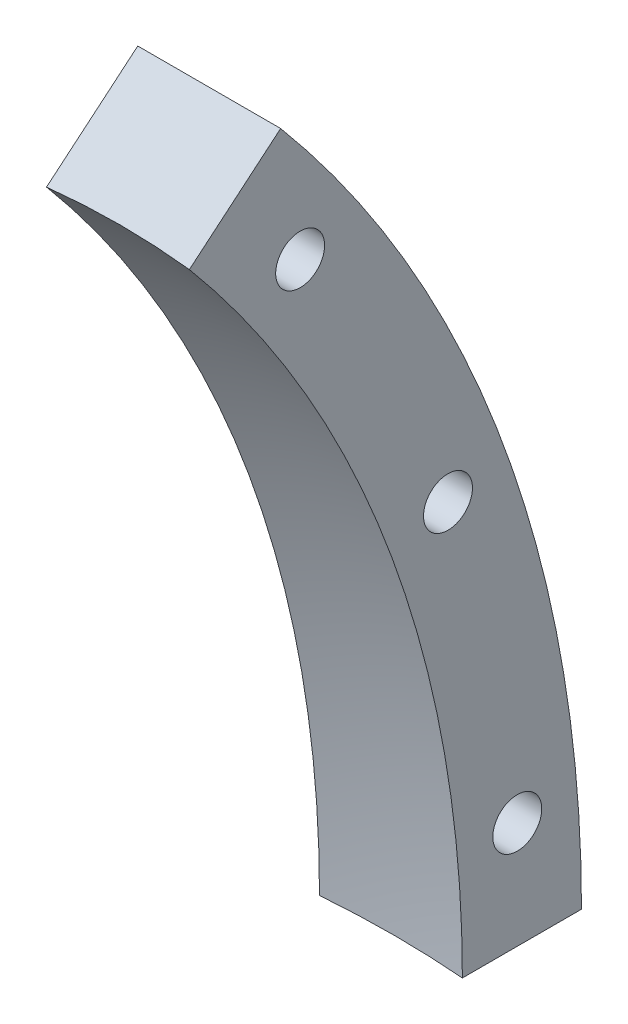
ISO-10303-21;
HEADER;
FILE_DESCRIPTION(('STEP AP214'),'2;1');
FILE_NAME('part.step','',(''),(''),'','','');
FILE_SCHEMA(('AUTOMOTIVE_DESIGN { 1 0 10303 214 1 1 1 1 }'));
ENDSEC;
DATA;
#1=APPLICATION_CONTEXT('core data for automotive mechanical design processes');
#2=APPLICATION_PROTOCOL_DEFINITION('international standard','automotive_design',2000,#1);
#3=PRODUCT_CONTEXT('',#1,'mechanical');
#4=PRODUCT('Part','Part','',(#3));
#5=PRODUCT_RELATED_PRODUCT_CATEGORY('part','',(#4));
#6=PRODUCT_DEFINITION_FORMATION('','',#4);
#7=PRODUCT_DEFINITION_CONTEXT('part definition',#1,'design');
#8=PRODUCT_DEFINITION('design','',#6,#7);
#9=PRODUCT_DEFINITION_SHAPE('','',#8);
#10=(LENGTH_UNIT() NAMED_UNIT(*) SI_UNIT(.MILLI.,.METRE.));
#11=(NAMED_UNIT(*) PLANE_ANGLE_UNIT() SI_UNIT($,.RADIAN.));
#12=(NAMED_UNIT(*) SI_UNIT($,.STERADIAN.) SOLID_ANGLE_UNIT());
#13=UNCERTAINTY_MEASURE_WITH_UNIT(LENGTH_MEASURE(1.E-05),#10,'distance_accuracy_value','');
#14=(GEOMETRIC_REPRESENTATION_CONTEXT(3) GLOBAL_UNCERTAINTY_ASSIGNED_CONTEXT((#13)) GLOBAL_UNIT_ASSIGNED_CONTEXT((#10,
#11,#12)) REPRESENTATION_CONTEXT('',''));
#15=CARTESIAN_POINT('',(0.,0.,0.));
#16=DIRECTION('',(0.,0.,1.));
#17=DIRECTION('',(1.,0.,0.));
#18=AXIS2_PLACEMENT_3D('',#15,#16,#17);
#19=CARTESIAN_POINT('',(-9.525,97.9608317162288,-116.745173131332));
#20=DIRECTION('',(1.,0.,0.));
#21=DIRECTION('',(0.,0.,-1.));
#22=AXIS2_PLACEMENT_3D('',#19,#20,#21);
#23=PLANE('',#22);
#24=CARTESIAN_POINT('',(-9.525,14.2508559391281,-162.888028743351));
#25=DIRECTION('',(1.,0.,0.));
#26=DIRECTION('',(0.,0.,-1.));
#27=AXIS2_PLACEMENT_3D('',#24,#25,#26);
#28=CIRCLE('',#27,3.26390000000001);
#29=CARTESIAN_POINT('',(-9.525,14.2508559391281,-166.151928743351));
#30=VERTEX_POINT('',#29);
#31=EDGE_CURVE('E92',#30,#30,#28,.T.);
#32=ORIENTED_EDGE('',*,*,#31,.T.);
#33=EDGE_LOOP('',(#32));
#34=FACE_BOUND('',#33,.T.);
#35=CARTESIAN_POINT('',(-9.525,55.9237938563149,-153.64936083046));
#36=DIRECTION('',(1.,0.,0.));
#37=DIRECTION('',(0.,0.,-1.));
#38=AXIS2_PLACEMENT_3D('',#35,#36,#37);
#39=CIRCLE('',#38,3.26389999999998);
#40=CARTESIAN_POINT('',(-9.525,55.9237938563149,-156.91326083046));
#41=VERTEX_POINT('',#40);
#42=EDGE_CURVE('E140',#41,#41,#39,.T.);
#43=ORIENTED_EDGE('',*,*,#42,.T.);
#44=EDGE_LOOP('',(#43));
#45=FACE_BOUND('',#44,.T.);
#46=CARTESIAN_POINT('',(-9.525,93.7856176406328,-133.939742894547));
#47=DIRECTION('',(1.,0.,0.));
#48=DIRECTION('',(0.,0.,-1.));
#49=AXIS2_PLACEMENT_3D('',#46,#47,#48);
#50=CIRCLE('',#49,3.26389999999998);
#51=CARTESIAN_POINT('',(-9.525,93.7856176406328,-137.203642894547));
#52=VERTEX_POINT('',#51);
#53=EDGE_CURVE('E132',#52,#52,#50,.T.);
#54=ORIENTED_EDGE('',*,*,#53,.T.);
#55=EDGE_LOOP('',(#54));
#56=FACE_BOUND('',#55,.T.);
#57=CARTESIAN_POINT('',(-9.525,0.,0.));
#58=DIRECTION('',(1.,0.,0.));
#59=DIRECTION('',(0.,0.,-1.));
#60=AXIS2_PLACEMENT_3D('',#57,#58,#59);
#61=CIRCLE('',#60,155.570469101813);
#62=CARTESIAN_POINT('',(-9.525,99.9987699717682,-119.173893368856));
#63=VERTEX_POINT('',#62);
#64=CARTESIAN_POINT('',(-9.525,0.,-155.570469101813));
#65=VERTEX_POINT('',#64);
#66=EDGE_CURVE('E54',#63,#65,#61,.F.);
#67=ORIENTED_EDGE('',*,*,#66,.F.);
#68=DIRECTION('',(0.,-0.64278760968654,0.766044443118977));
#69=VECTOR('',#68,1.);
#70=CARTESIAN_POINT('',(-9.525,97.9608317162288,-116.745173131332));
#71=LINE('',#70,#69);
#72=CARTESIAN_POINT('',(-9.525,110.205935680757,-131.338319772749));
#73=VERTEX_POINT('',#72);
#74=EDGE_CURVE('E114',#73,#63,#71,.T.);
#75=ORIENTED_EDGE('',*,*,#74,.F.);
#76=CARTESIAN_POINT('',(-9.525,0.,0.));
#77=DIRECTION('',(-1.,0.,0.));
#78=DIRECTION('',(0.,0.,1.));
#79=AXIS2_PLACEMENT_3D('',#76,#77,#78);
#80=CIRCLE('',#79,171.45);
#81=CARTESIAN_POINT('',(-9.525,0.,-171.45));
#82=VERTEX_POINT('',#81);
#83=EDGE_CURVE('E47',#73,#82,#80,.T.);
#84=ORIENTED_EDGE('',*,*,#83,.T.);
#85=DIRECTION('',(0.,0.,1.));
#86=VECTOR('',#85,1.);
#87=CARTESIAN_POINT('',(-9.525,0.,-152.4));
#88=LINE('',#87,#86);
#89=EDGE_CURVE('E102',#82,#65,#88,.T.);
#90=ORIENTED_EDGE('',*,*,#89,.T.);
#91=EDGE_LOOP('',(#67,#75,#84,#90));
#92=FACE_BOUND('',#91,.T.);
#93=ADVANCED_FACE('F39',(#34,#45,#56,#92),#23,.F.);
#94=CARTESIAN_POINT('',(0.,0.,0.));
#95=DIRECTION('',(-1.,0.,0.));
#96=DIRECTION('',(0.,0.,1.));
#97=AXIS2_PLACEMENT_3D('',#94,#95,#96);
#98=CYLINDRICAL_SURFACE('',#97,171.45);
#99=CARTESIAN_POINT('',(9.525,0.,0.));
#100=DIRECTION('',(-1.,0.,0.));
#101=DIRECTION('',(0.,0.,1.));
#102=AXIS2_PLACEMENT_3D('',#99,#100,#101);
#103=CIRCLE('',#102,171.45);
#104=CARTESIAN_POINT('',(9.525,110.205935680757,-131.338319772749));
#105=VERTEX_POINT('',#104);
#106=CARTESIAN_POINT('',(9.525,0.,-171.45));
#107=VERTEX_POINT('',#106);
#108=EDGE_CURVE('E118',#105,#107,#103,.T.);
#109=ORIENTED_EDGE('',*,*,#108,.T.);
#110=DIRECTION('',(-1.,0.,0.));
#111=VECTOR('',#110,1.);
#112=CARTESIAN_POINT('',(-9.525,0.,-171.45));
#113=LINE('',#112,#111);
#114=EDGE_CURVE('E96',#107,#82,#113,.T.);
#115=ORIENTED_EDGE('',*,*,#114,.T.);
#116=ORIENTED_EDGE('',*,*,#83,.F.);
#117=DIRECTION('',(-1.,0.,0.));
#118=VECTOR('',#117,1.);
#119=CARTESIAN_POINT('',(-9.525,110.205935680757,-131.338319772749));
#120=LINE('',#119,#118);
#121=EDGE_CURVE('E111',#105,#73,#120,.T.);
#122=ORIENTED_EDGE('',*,*,#121,.F.);
#123=EDGE_LOOP('',(#109,#115,#116,#122));
#124=FACE_BOUND('',#123,.T.);
#125=ADVANCED_FACE('F123',(#124),#98,.T.);
#126=CARTESIAN_POINT('',(9.525,110.205935680757,-131.338319772749));
#127=DIRECTION('',(-1.,0.,0.));
#128=DIRECTION('',(0.,0.,1.));
#129=AXIS2_PLACEMENT_3D('',#126,#127,#128);
#130=PLANE('',#129);
#131=CARTESIAN_POINT('',(9.525,14.2508559391281,-162.888028743351));
#132=DIRECTION('',(1.,0.,0.));
#133=DIRECTION('',(0.,0.,-1.));
#134=AXIS2_PLACEMENT_3D('',#131,#132,#133);
#135=CIRCLE('',#134,3.26390000000001);
#136=CARTESIAN_POINT('',(9.525,14.2508559391281,-166.151928743351));
#137=VERTEX_POINT('',#136);
#138=EDGE_CURVE('E144',#137,#137,#135,.T.);
#139=ORIENTED_EDGE('',*,*,#138,.F.);
#140=EDGE_LOOP('',(#139));
#141=FACE_BOUND('',#140,.T.);
#142=CARTESIAN_POINT('',(9.525,55.9237938563149,-153.64936083046));
#143=DIRECTION('',(1.,0.,0.));
#144=DIRECTION('',(0.,0.,-1.));
#145=AXIS2_PLACEMENT_3D('',#142,#143,#144);
#146=CIRCLE('',#145,3.26389999999998);
#147=CARTESIAN_POINT('',(9.525,55.9237938563149,-156.91326083046));
#148=VERTEX_POINT('',#147);
#149=EDGE_CURVE('E136',#148,#148,#146,.T.);
#150=ORIENTED_EDGE('',*,*,#149,.F.);
#151=EDGE_LOOP('',(#150));
#152=FACE_BOUND('',#151,.T.);
#153=CARTESIAN_POINT('',(9.525,93.7856176406328,-133.939742894547));
#154=DIRECTION('',(1.,0.,0.));
#155=DIRECTION('',(0.,0.,-1.));
#156=AXIS2_PLACEMENT_3D('',#153,#154,#155);
#157=CIRCLE('',#156,3.26389999999998);
#158=CARTESIAN_POINT('',(9.525,93.7856176406328,-137.203642894547));
#159=VERTEX_POINT('',#158);
#160=EDGE_CURVE('E128',#159,#159,#157,.T.);
#161=ORIENTED_EDGE('',*,*,#160,.F.);
#162=EDGE_LOOP('',(#161));
#163=FACE_BOUND('',#162,.T.);
#164=CARTESIAN_POINT('',(9.525,0.,0.));
#165=DIRECTION('',(-1.,0.,0.));
#166=DIRECTION('',(0.,0.,1.));
#167=AXIS2_PLACEMENT_3D('',#164,#165,#166);
#168=CIRCLE('',#167,155.570469101813);
#169=CARTESIAN_POINT('',(9.525,0.,-155.570469101813));
#170=VERTEX_POINT('',#169);
#171=CARTESIAN_POINT('',(9.52499999999997,99.9987699717682,-119.173893368856));
#172=VERTEX_POINT('',#171);
#173=EDGE_CURVE('E78',#170,#172,#168,.F.);
#174=ORIENTED_EDGE('',*,*,#173,.F.);
#175=DIRECTION('',(0.,0.,-1.));
#176=VECTOR('',#175,1.);
#177=CARTESIAN_POINT('',(9.525,0.,-171.45));
#178=LINE('',#177,#176);
#179=EDGE_CURVE('E88',#170,#107,#178,.T.);
#180=ORIENTED_EDGE('',*,*,#179,.T.);
#181=ORIENTED_EDGE('',*,*,#108,.F.);
#182=DIRECTION('',(0.,0.64278760968654,-0.766044443118977));
#183=VECTOR('',#182,1.);
#184=CARTESIAN_POINT('',(9.525,110.205935680757,-131.338319772749));
#185=LINE('',#184,#183);
#186=EDGE_CURVE('E90',#172,#105,#185,.T.);
#187=ORIENTED_EDGE('',*,*,#186,.F.);
#188=EDGE_LOOP('',(#174,#180,#181,#187));
#189=FACE_BOUND('',#188,.T.);
#190=ADVANCED_FACE('F86',(#141,#152,#163,#189),#130,.F.);
#191=CARTESIAN_POINT('',(0.,0.,0.));
#192=DIRECTION('',(0.,-0.766044443118977,-0.64278760968654));
#193=DIRECTION('',(0.,0.64278760968654,-0.766044443118977));
#194=AXIS2_PLACEMENT_3D('',#191,#192,#193);
#195=PLANE('',#194);
#196=CARTESIAN_POINT('',(0.,24.4902079290572,-29.186293282833));
#197=DIRECTION('',(0.,-0.766044443118977,-0.64278760968654));
#198=DIRECTION('',(0.,0.642787609686541,-0.766044443118977));
#199=AXIS2_PLACEMENT_3D('',#196,#197,#198);
#200=CIRCLE('',#199,117.856);
#201=EDGE_CURVE('E98',#172,#63,#200,.F.);
#202=ORIENTED_EDGE('',*,*,#201,.F.);
#203=ORIENTED_EDGE('',*,*,#186,.T.);
#204=ORIENTED_EDGE('',*,*,#121,.T.);
#205=ORIENTED_EDGE('',*,*,#74,.T.);
#206=EDGE_LOOP('',(#202,#203,#204,#205));
#207=FACE_BOUND('',#206,.T.);
#208=ADVANCED_FACE('F125',(#207),#195,.F.);
#209=CARTESIAN_POINT('',(0.,0.,0.));
#210=DIRECTION('',(0.,-1.,0.));
#211=DIRECTION('',(0.,0.,-1.));
#212=AXIS2_PLACEMENT_3D('',#209,#210,#211);
#213=PLANE('',#212);
#214=ORIENTED_EDGE('',*,*,#179,.F.);
#215=CARTESIAN_POINT('',(0.,0.,-38.1));
#216=DIRECTION('',(0.,-1.,0.));
#217=DIRECTION('',(0.,0.,-1.));
#218=AXIS2_PLACEMENT_3D('',#215,#216,#217);
#219=CIRCLE('',#218,117.856);
#220=EDGE_CURVE('E11',#170,#65,#219,.F.);
#221=ORIENTED_EDGE('',*,*,#220,.T.);
#222=ORIENTED_EDGE('',*,*,#89,.F.);
#223=ORIENTED_EDGE('',*,*,#114,.F.);
#224=EDGE_LOOP('',(#214,#221,#222,#223));
#225=FACE_BOUND('',#224,.T.);
#226=ADVANCED_FACE('F95',(#225),#213,.T.);
#227=CARTESIAN_POINT('',(0.,0.,0.));
#228=DIRECTION('',(-1.,0.,0.));
#229=DIRECTION('',(0.,0.,1.));
#230=AXIS2_PLACEMENT_3D('',#227,#228,#229);
#231=DEGENERATE_TOROIDAL_SURFACE('',#230,38.1,117.856,.T.);
#232=ORIENTED_EDGE('',*,*,#201,.T.);
#233=ORIENTED_EDGE('',*,*,#66,.T.);
#234=ORIENTED_EDGE('',*,*,#220,.F.);
#235=ORIENTED_EDGE('',*,*,#173,.T.);
#236=EDGE_LOOP('',(#232,#233,#234,#235));
#237=FACE_BOUND('',#236,.T.);
#238=ADVANCED_FACE('F77',(#237),#231,.F.);
#239=CARTESIAN_POINT('',(-9.525,93.7856176406328,-133.939742894547));
#240=DIRECTION('',(1.,0.,0.));
#241=DIRECTION('',(0.,0.,-1.));
#242=AXIS2_PLACEMENT_3D('',#239,#240,#241);
#243=CYLINDRICAL_SURFACE('',#242,3.26389999999998);
#244=ORIENTED_EDGE('',*,*,#53,.F.);
#245=EDGE_LOOP('',(#244));
#246=FACE_BOUND('',#245,.T.);
#247=ORIENTED_EDGE('',*,*,#160,.T.);
#248=EDGE_LOOP('',(#247));
#249=FACE_BOUND('',#248,.T.);
#250=ADVANCED_FACE('F168',(#246,#249),#243,.F.);
#251=CARTESIAN_POINT('',(-9.525,55.9237938563149,-153.64936083046));
#252=DIRECTION('',(1.,0.,0.));
#253=DIRECTION('',(0.,0.,-1.));
#254=AXIS2_PLACEMENT_3D('',#251,#252,#253);
#255=CYLINDRICAL_SURFACE('',#254,3.26389999999998);
#256=ORIENTED_EDGE('',*,*,#42,.F.);
#257=EDGE_LOOP('',(#256));
#258=FACE_BOUND('',#257,.T.);
#259=ORIENTED_EDGE('',*,*,#149,.T.);
#260=EDGE_LOOP('',(#259));
#261=FACE_BOUND('',#260,.T.);
#262=ADVANCED_FACE('F157',(#258,#261),#255,.F.);
#263=CARTESIAN_POINT('',(-9.525,14.2508559391281,-162.888028743351));
#264=DIRECTION('',(1.,0.,0.));
#265=DIRECTION('',(0.,0.,-1.));
#266=AXIS2_PLACEMENT_3D('',#263,#264,#265);
#267=CYLINDRICAL_SURFACE('',#266,3.26390000000001);
#268=ORIENTED_EDGE('',*,*,#31,.F.);
#269=EDGE_LOOP('',(#268));
#270=FACE_BOUND('',#269,.T.);
#271=ORIENTED_EDGE('',*,*,#138,.T.);
#272=EDGE_LOOP('',(#271));
#273=FACE_BOUND('',#272,.T.);
#274=ADVANCED_FACE('F154',(#270,#273),#267,.F.);
#275=CLOSED_SHELL('',(#93,#125,#190,#208,#226,#238,#250,#262,#274));
#276=MANIFOLD_SOLID_BREP('B2',#275);
#277=ADVANCED_BREP_SHAPE_REPRESENTATION('',(#18,#276),#14);
#278=SHAPE_DEFINITION_REPRESENTATION(#9,#277);
ENDSEC;
END-ISO-10303-21;
